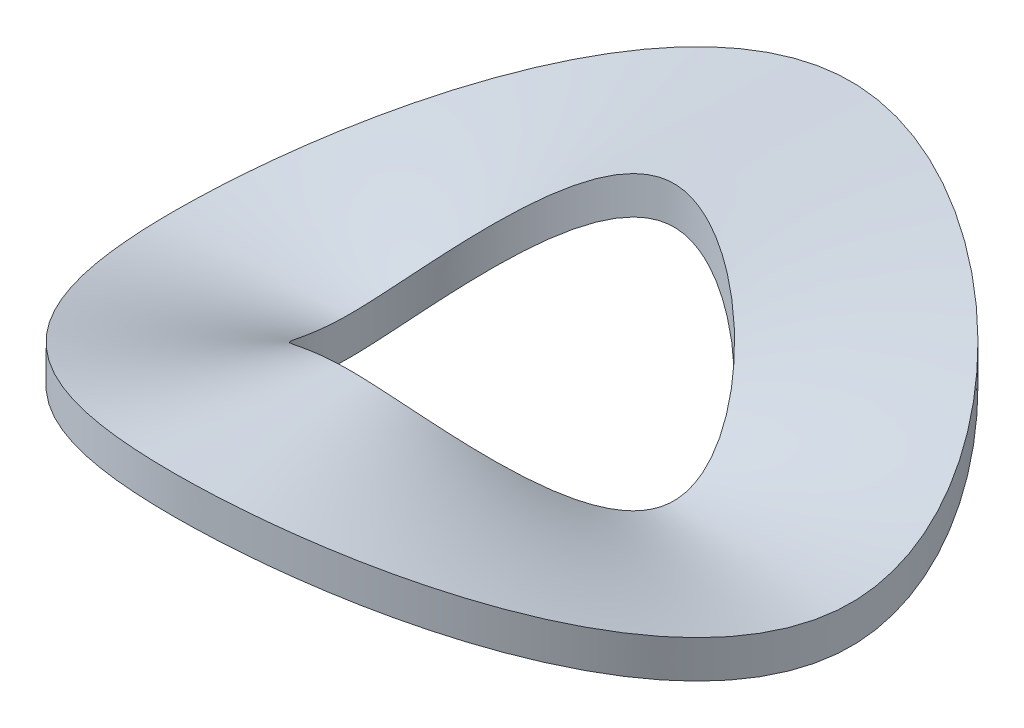
ISO-10303-21;
HEADER;
FILE_DESCRIPTION(('STEP AP214'),'2;1');
FILE_NAME('part.step','',(''),(''),'','','');
FILE_SCHEMA(('AUTOMOTIVE_DESIGN { 1 0 10303 214 1 1 1 1 }'));
ENDSEC;
DATA;
#1=APPLICATION_CONTEXT('core data for automotive mechanical design processes');
#2=APPLICATION_PROTOCOL_DEFINITION('international standard','automotive_design',2000,#1);
#3=PRODUCT_CONTEXT('',#1,'mechanical');
#4=PRODUCT('Part','Part','',(#3));
#5=PRODUCT_RELATED_PRODUCT_CATEGORY('part','',(#4));
#6=PRODUCT_DEFINITION_FORMATION('','',#4);
#7=PRODUCT_DEFINITION_CONTEXT('part definition',#1,'design');
#8=PRODUCT_DEFINITION('design','',#6,#7);
#9=PRODUCT_DEFINITION_SHAPE('','',#8);
#10=(LENGTH_UNIT() NAMED_UNIT(*) SI_UNIT(.MILLI.,.METRE.));
#11=(NAMED_UNIT(*) PLANE_ANGLE_UNIT() SI_UNIT($,.RADIAN.));
#12=(NAMED_UNIT(*) SI_UNIT($,.STERADIAN.) SOLID_ANGLE_UNIT());
#13=UNCERTAINTY_MEASURE_WITH_UNIT(LENGTH_MEASURE(1.E-05),#10,'distance_accuracy_value','');
#14=(GEOMETRIC_REPRESENTATION_CONTEXT(3) GLOBAL_UNCERTAINTY_ASSIGNED_CONTEXT((#13)) GLOBAL_UNIT_ASSIGNED_CONTEXT((#10,
#11,#12)) REPRESENTATION_CONTEXT('',''));
#15=CARTESIAN_POINT('',(0.,0.,0.));
#16=DIRECTION('',(0.,0.,1.));
#17=DIRECTION('',(1.,0.,0.));
#18=AXIS2_PLACEMENT_3D('',#15,#16,#17);
#19=CARTESIAN_POINT('',(-2.15,0.5,0.));
#20=CARTESIAN_POINT('',(-2.14999999999918,0.50000000000048,-0.0537500000001796));
#21=CARTESIAN_POINT('',(-2.14462499999738,0.507500000001514,-0.161250000000559));
#22=CARTESIAN_POINT('',(-2.12124374999426,0.539000000003236,-0.321693750001171));
#23=CARTESIAN_POINT('',(-2.08334999999078,0.588500000005074,-0.480525000001808));
#24=CARTESIAN_POINT('',(-1.77374999997496,0.980000000007716,-1.41899999998473));
#25=CARTESIAN_POINT('',(0.215000000067077,3.20000000000027,-3.01000000000131));
#26=CARTESIAN_POINT('',(3.2249999999892,-1.00000000001507,-3.33506144792675E-11));
#27=CARTESIAN_POINT('',(0.215000000010679,3.19999999999973,3.01000000000013));
#28=CARTESIAN_POINT('',(-1.77375000001122,0.979999999992285,1.41900000000339));
#29=CARTESIAN_POINT('',(-2.0833500000054,0.588499999996614,0.480525000001368));
#30=CARTESIAN_POINT('',(-2.12124375000405,0.538999999997525,0.321693750000973));
#31=CARTESIAN_POINT('',(-2.14462500000229,0.507499999998637,0.16125000000052));
#32=CARTESIAN_POINT('',(-2.15000000000082,0.49999999999952,0.05375000000018));
#33=CARTESIAN_POINT('',(-2.15,0.5,0.));
#34=CARTESIAN_POINT('',(-2.15,0.458333333333333,0.));
#35=CARTESIAN_POINT('',(-2.14999999999918,0.458333333333813,-0.0537500000001796));
#36=CARTESIAN_POINT('',(-2.14462499999738,0.465833333334847,-0.161250000000559));
#37=CARTESIAN_POINT('',(-2.12124374999426,0.49733333333657,-0.321693750001171));
#38=CARTESIAN_POINT('',(-2.08334999999078,0.546833333338407,-0.480525000001808));
#39=CARTESIAN_POINT('',(-1.77374999997496,0.938333333341049,-1.41899999998473));
#40=CARTESIAN_POINT('',(0.215000000067077,3.1583333333336,-3.01000000000131));
#41=CARTESIAN_POINT('',(3.2249999999892,-1.04166666668174,-3.33506144792675E-11));
#42=CARTESIAN_POINT('',(0.215000000010679,3.15833333333306,3.01000000000013));
#43=CARTESIAN_POINT('',(-1.77375000001122,0.938333333325618,1.41900000000339));
#44=CARTESIAN_POINT('',(-2.0833500000054,0.546833333329948,0.480525000001368));
#45=CARTESIAN_POINT('',(-2.12124375000405,0.497333333330858,0.321693750000973));
#46=CARTESIAN_POINT('',(-2.14462500000229,0.46583333333197,0.16125000000052));
#47=CARTESIAN_POINT('',(-2.15000000000082,0.458333333332854,0.05375000000018));
#48=CARTESIAN_POINT('',(-2.15,0.458333333333333,0.));
#49=CARTESIAN_POINT('',(-2.15,0.375,0.));
#50=CARTESIAN_POINT('',(-2.14999999999918,0.375000000000479,-0.0537500000001796));
#51=CARTESIAN_POINT('',(-2.14462499999738,0.382500000001514,-0.161250000000559));
#52=CARTESIAN_POINT('',(-2.12124374999426,0.414000000003236,-0.321693750001171));
#53=CARTESIAN_POINT('',(-2.08334999999078,0.463500000005074,-0.480525000001808));
#54=CARTESIAN_POINT('',(-1.77374999997496,0.855000000007716,-1.41899999998473));
#55=CARTESIAN_POINT('',(0.215000000067077,3.07500000000027,-3.01000000000131));
#56=CARTESIAN_POINT('',(3.2249999999892,-1.12500000001507,-3.3350655136849E-11));
#57=CARTESIAN_POINT('',(0.21500000001068,3.07499999999973,3.01000000000013));
#58=CARTESIAN_POINT('',(-1.77375000001122,0.854999999992285,1.4190000000034));
#59=CARTESIAN_POINT('',(-2.0833500000054,0.463499999996614,0.480525000001368));
#60=CARTESIAN_POINT('',(-2.12124375000405,0.413999999997525,0.321693750000973));
#61=CARTESIAN_POINT('',(-2.14462500000229,0.382499999998637,0.16125000000052));
#62=CARTESIAN_POINT('',(-2.15000000000082,0.37499999999952,0.05375000000018));
#63=CARTESIAN_POINT('',(-2.15,0.375,0.));
#64=CARTESIAN_POINT('',(-2.15,0.25,0.));
#65=CARTESIAN_POINT('',(-2.14999999999918,0.250000000000479,-0.0537500000001796));
#66=CARTESIAN_POINT('',(-2.14462499999738,0.257500000001514,-0.161250000000559));
#67=CARTESIAN_POINT('',(-2.12124374999426,0.289000000003236,-0.321693750001171));
#68=CARTESIAN_POINT('',(-2.08334999999078,0.338500000005073,-0.480525000001807));
#69=CARTESIAN_POINT('',(-1.77374999997496,0.730000000007715,-1.41899999998472));
#70=CARTESIAN_POINT('',(0.215000000067077,2.95000000000027,-3.01000000000131));
#71=CARTESIAN_POINT('',(3.2249999999892,-1.25000000001507,-3.33505331641046E-11));
#72=CARTESIAN_POINT('',(0.21500000001068,2.94999999999973,3.01000000000013));
#73=CARTESIAN_POINT('',(-1.77375000001122,0.729999999992284,1.41900000000339));
#74=CARTESIAN_POINT('',(-2.0833500000054,0.338499999996614,0.480525000001367));
#75=CARTESIAN_POINT('',(-2.12124375000405,0.288999999997524,0.321693750000972));
#76=CARTESIAN_POINT('',(-2.14462500000229,0.257499999998636,0.16125000000052));
#77=CARTESIAN_POINT('',(-2.15000000000082,0.24999999999952,0.0537500000001799));
#78=CARTESIAN_POINT('',(-2.15,0.25,0.));
#79=CARTESIAN_POINT('',(-2.15,0.125,0.));
#80=CARTESIAN_POINT('',(-2.14999999999918,0.12500000000048,-0.0537500000001797));
#81=CARTESIAN_POINT('',(-2.14462499999739,0.132500000001514,-0.161250000000559));
#82=CARTESIAN_POINT('',(-2.12124374999426,0.164000000003237,-0.321693750001171));
#83=CARTESIAN_POINT('',(-2.08334999999078,0.213500000005074,-0.480525000001808));
#84=CARTESIAN_POINT('',(-1.77374999997496,0.605000000007717,-1.41899999998473));
#85=CARTESIAN_POINT('',(0.215000000067077,2.82500000000027,-3.01000000000131));
#86=CARTESIAN_POINT('',(3.2249999999892,-1.37500000001507,-3.33503163236701E-11));
#87=CARTESIAN_POINT('',(0.21500000001068,2.82499999999973,3.01000000000013));
#88=CARTESIAN_POINT('',(-1.77375000001122,0.604999999992285,1.4190000000034));
#89=CARTESIAN_POINT('',(-2.0833500000054,0.213499999996615,0.480525000001368));
#90=CARTESIAN_POINT('',(-2.12124375000406,0.163999999997525,0.321693750000973));
#91=CARTESIAN_POINT('',(-2.14462500000229,0.132499999998637,0.161250000000521));
#92=CARTESIAN_POINT('',(-2.15000000000082,0.124999999999521,0.0537500000001801));
#93=CARTESIAN_POINT('',(-2.15,0.125,0.));
#94=CARTESIAN_POINT('',(-2.15,0.0416666666666665,0.));
#95=CARTESIAN_POINT('',(-2.14999999999918,0.0416666666671461,-0.0537500000001797));
#96=CARTESIAN_POINT('',(-2.14462499999738,0.0491666666681805,-0.161250000000559));
#97=CARTESIAN_POINT('',(-2.12124374999426,0.0806666666699028,-0.321693750001171));
#98=CARTESIAN_POINT('',(-2.08334999999078,0.13016666667174,-0.480525000001808));
#99=CARTESIAN_POINT('',(-1.77374999997496,0.521666666674382,-1.41899999998472));
#100=CARTESIAN_POINT('',(0.215000000067077,2.74166666666693,-3.01000000000131));
#101=CARTESIAN_POINT('',(3.2249999999892,-1.4583333333484,-3.33507364520119E-11));
#102=CARTESIAN_POINT('',(0.215000000010679,2.7416666666664,3.01000000000013));
#103=CARTESIAN_POINT('',(-1.77375000001122,0.521666666658951,1.41900000000339));
#104=CARTESIAN_POINT('',(-2.0833500000054,0.130166666663281,0.480525000001367));
#105=CARTESIAN_POINT('',(-2.12124375000405,0.0806666666641911,0.321693750000972));
#106=CARTESIAN_POINT('',(-2.14462500000229,0.0491666666653031,0.16125000000052));
#107=CARTESIAN_POINT('',(-2.15000000000082,0.041666666666187,0.0537500000001798));
#108=CARTESIAN_POINT('',(-2.15,0.0416666666666665,0.));
#109=CARTESIAN_POINT('',(-2.15,0.,0.));
#110=CARTESIAN_POINT('',(-2.14999999999918,4.79788683961516E-13,-0.0537500000001797));
#111=CARTESIAN_POINT('',(-2.14462499999738,0.0075000000015142,-0.161250000000559));
#112=CARTESIAN_POINT('',(-2.12124374999426,0.0390000000032364,-0.321693750001171));
#113=CARTESIAN_POINT('',(-2.08334999999078,0.0885000000050739,-0.480525000001808));
#114=CARTESIAN_POINT('',(-1.77374999997496,0.480000000007716,-1.41899999998473));
#115=CARTESIAN_POINT('',(0.215000000067077,2.70000000000027,-3.01000000000131));
#116=CARTESIAN_POINT('',(3.2249999999892,-1.50000000001507,-3.3350573821686E-11));
#117=CARTESIAN_POINT('',(0.215000000010679,2.69999999999973,3.01000000000013));
#118=CARTESIAN_POINT('',(-1.77375000001122,0.479999999992285,1.41900000000339));
#119=CARTESIAN_POINT('',(-2.0833500000054,0.0884999999966144,0.480525000001367));
#120=CARTESIAN_POINT('',(-2.12124375000405,0.0389999999975248,0.321693750000972));
#121=CARTESIAN_POINT('',(-2.14462500000229,0.00749999999863686,0.16125000000052));
#122=CARTESIAN_POINT('',(-2.15000000000082,-4.79336368367682E-13,0.0537500000001799));
#123=CARTESIAN_POINT('',(-2.15,0.,0.));
#124=B_SPLINE_SURFACE_WITH_KNOTS('',3,3,((#19,#20,#21,#22,#23,#24,#25,#26,#27,#28,#29,#30,#31,
#32,#33),(#34,#35,#36,#37,#38,#39,#40,#41,#42,#43,#44,#45,#46,#47,#48),(#49,#50,#51,#52,#53,#54,
#55,#56,#57,#58,#59,#60,#61,#62,#63),(#64,#65,#66,#67,#68,#69,#70,#71,#72,#73,#74,#75,#76,#77,
#78),(#79,#80,#81,#82,#83,#84,#85,#86,#87,#88,#89,#90,#91,#92,#93),(#94,#95,#96,#97,#98,#99,
#100,#101,#102,#103,#104,#105,#106,#107,#108),(#109,#110,#111,#112,#113,#114,#115,#116,#117,
#118,#119,#120,#121,#122,#123)),.UNSPECIFIED.,.F.,.T.,.F.,(4,1,1,1,4),(4,1,1,1,1,1,1,1,1,1,1,1,
4),(0.850746268656716,0.888059701492537,0.925373134328358,0.962686567164179,1.),(0.,0.0125,
0.0249999999999999,0.0375000000000001,0.05,0.249999999994977,0.500000000000455,0.75,0.95,0.9625,
0.975,0.9875,1.),.UNSPECIFIED.);
#125=CARTESIAN_POINT('',(-2.15,0.,0.));
#126=CARTESIAN_POINT('',(-2.14999999999918,4.79788683961516E-13,-0.0537500000001797));
#127=CARTESIAN_POINT('',(-2.14462499999738,0.0075000000015142,-0.161250000000559));
#128=CARTESIAN_POINT('',(-2.12124374999426,0.0390000000032364,-0.321693750001171));
#129=CARTESIAN_POINT('',(-2.08334999999078,0.0885000000050739,-0.480525000001808));
#130=CARTESIAN_POINT('',(-1.77374999997496,0.480000000007716,-1.41899999998473));
#131=CARTESIAN_POINT('',(0.215000000067077,2.70000000000027,-3.01000000000131));
#132=CARTESIAN_POINT('',(3.2249999999892,-1.50000000001507,-3.3350573821686E-11));
#133=CARTESIAN_POINT('',(0.215000000010679,2.69999999999973,3.01000000000013));
#134=CARTESIAN_POINT('',(-1.77375000001122,0.479999999992285,1.41900000000339));
#135=CARTESIAN_POINT('',(-2.0833500000054,0.0884999999966144,0.480525000001367));
#136=CARTESIAN_POINT('',(-2.12124375000405,0.0389999999975248,0.321693750000972));
#137=CARTESIAN_POINT('',(-2.14462500000229,0.00749999999863686,0.16125000000052));
#138=CARTESIAN_POINT('',(-2.15000000000082,-4.79336368367682E-13,0.0537500000001799));
#139=CARTESIAN_POINT('',(-2.15,0.,0.));
#140=B_SPLINE_CURVE_WITH_KNOTS('',3,(#125,#126,#127,#128,#129,#130,#131,#132,#133,#134,#135,
#136,#137,#138,#139),.UNSPECIFIED.,.T.,.F.,(4,1,1,1,1,1,1,1,1,1,1,1,4),(0.,0.0125,
0.0249999999999999,0.0375000000000001,0.05,0.249999999994977,0.500000000000455,0.75,0.95,0.9625,
0.975,0.9875,1.),.UNSPECIFIED.);
#141=CARTESIAN_POINT('',(-2.15,0.,0.));
#142=VERTEX_POINT('',#141);
#143=EDGE_CURVE('E11',#142,#142,#140,.T.);
#144=CARTESIAN_POINT('',(-2.15,0.5,0.));
#145=CARTESIAN_POINT('',(-2.14999999999918,0.50000000000048,-0.0537500000001796));
#146=CARTESIAN_POINT('',(-2.14462499999738,0.507500000001514,-0.161250000000559));
#147=CARTESIAN_POINT('',(-2.12124374999426,0.539000000003236,-0.321693750001171));
#148=CARTESIAN_POINT('',(-2.08334999999078,0.588500000005074,-0.480525000001808));
#149=CARTESIAN_POINT('',(-1.77374999997496,0.980000000007716,-1.41899999998473));
#150=CARTESIAN_POINT('',(0.215000000067077,3.20000000000027,-3.01000000000131));
#151=CARTESIAN_POINT('',(3.2249999999892,-1.00000000001507,-3.33506144792675E-11));
#152=CARTESIAN_POINT('',(0.215000000010679,3.19999999999973,3.01000000000013));
#153=CARTESIAN_POINT('',(-1.77375000001122,0.979999999992285,1.41900000000339));
#154=CARTESIAN_POINT('',(-2.0833500000054,0.588499999996614,0.480525000001368));
#155=CARTESIAN_POINT('',(-2.12124375000405,0.538999999997525,0.321693750000973));
#156=CARTESIAN_POINT('',(-2.14462500000229,0.507499999998637,0.16125000000052));
#157=CARTESIAN_POINT('',(-2.15000000000082,0.49999999999952,0.05375000000018));
#158=CARTESIAN_POINT('',(-2.15,0.5,0.));
#159=B_SPLINE_CURVE_WITH_KNOTS('',3,(#144,#145,#146,#147,#148,#149,#150,#151,#152,#153,#154,
#155,#156,#157,#158),.UNSPECIFIED.,.T.,.F.,(4,1,1,1,1,1,1,1,1,1,1,1,4),(0.,0.0125,
0.0249999999999999,0.0375000000000001,0.05,0.249999999994977,0.500000000000455,0.75,0.95,0.9625,
0.975,0.9875,1.),.UNSPECIFIED.);
#160=CARTESIAN_POINT('',(-2.15,0.5,0.));
#161=VERTEX_POINT('',#160);
#162=EDGE_CURVE('E57',#161,#161,#159,.T.);
#163=ORIENTED_EDGE('',*,*,#143,.T.);
#164=EDGE_LOOP('',(#163));
#165=FACE_BOUND('',#164,.T.);
#166=ORIENTED_EDGE('',*,*,#162,.F.);
#167=EDGE_LOOP('',(#166));
#168=FACE_BOUND('',#167,.T.);
#169=ADVANCED_FACE('F46',(#165,#168),#124,.T.);
#170=CARTESIAN_POINT('',(-4.5,0.5,0.));
#171=CARTESIAN_POINT('',(-4.49999999999829,0.50000000000048,-0.112500000000376));
#172=CARTESIAN_POINT('',(-4.48874999999452,0.507500000001514,-0.33750000000117));
#173=CARTESIAN_POINT('',(-4.43981249998799,0.539000000003236,-0.67331250000245));
#174=CARTESIAN_POINT('',(-4.36049999998069,0.588500000005074,-1.00575000000378));
#175=CARTESIAN_POINT('',(-3.71249999994758,0.980000000007716,-2.96999999996803));
#176=CARTESIAN_POINT('',(0.450000000140394,3.20000000000027,-6.30000000000274));
#177=CARTESIAN_POINT('',(6.7499999999774,-1.00000000001507,-6.98035921599394E-11));
#178=CARTESIAN_POINT('',(0.450000000022352,3.19999999999973,6.30000000000027));
#179=CARTESIAN_POINT('',(-3.71250000002348,0.979999999992285,2.97000000000711));
#180=CARTESIAN_POINT('',(-4.3605000000113,0.588499999996614,1.00575000000286));
#181=CARTESIAN_POINT('',(-4.43981250000848,0.538999999997525,0.673312500002035));
#182=CARTESIAN_POINT('',(-4.4887500000048,0.507499999998637,0.337500000001089));
#183=CARTESIAN_POINT('',(-4.50000000000171,0.499999999999521,0.112500000000377));
#184=CARTESIAN_POINT('',(-4.5,0.5,0.));
#185=CARTESIAN_POINT('',(-4.30416666666667,0.5,0.));
#186=CARTESIAN_POINT('',(-4.30416666666503,0.50000000000048,-0.107604166667026));
#187=CARTESIAN_POINT('',(-4.29340624999476,0.507500000001514,-0.322812500001119));
#188=CARTESIAN_POINT('',(-4.24659843748851,0.539000000003236,-0.644010937502344));
#189=CARTESIAN_POINT('',(-4.17073749998153,0.588500000005074,-0.961981250003619));
#190=CARTESIAN_POINT('',(-3.55093749994986,0.980000000007716,-2.84074999996942));
#191=CARTESIAN_POINT('',(0.430416666800951,3.20000000000027,-6.02583333333596));
#192=CARTESIAN_POINT('',(6.45624999997838,-1.00000000001507,-6.67661997737212E-11));
#193=CARTESIAN_POINT('',(0.430416666688046,3.19999999999973,6.02583333333359));
#194=CARTESIAN_POINT('',(-3.55093750002246,0.979999999992285,2.8407500000068));
#195=CARTESIAN_POINT('',(-4.17073750001081,0.588499999996614,0.961981250002738));
#196=CARTESIAN_POINT('',(-4.24659843750811,0.538999999997525,0.644010937501947));
#197=CARTESIAN_POINT('',(-4.29340625000459,0.507499999998637,0.322812500001042));
#198=CARTESIAN_POINT('',(-4.3041666666683,0.499999999999521,0.107604166667027));
#199=CARTESIAN_POINT('',(-4.30416666666667,0.5,0.));
#200=CARTESIAN_POINT('',(-3.9125,0.499999999999999,0.));
#201=CARTESIAN_POINT('',(-3.91249999999851,0.500000000000479,-0.0978125000003266));
#202=CARTESIAN_POINT('',(-3.90271874999524,0.507500000001513,-0.293437500001017));
#203=CARTESIAN_POINT('',(-3.86017031248956,0.539000000003235,-0.58540781250213));
#204=CARTESIAN_POINT('',(-3.79121249998322,0.588500000005072,-0.87444375000329));
#205=CARTESIAN_POINT('',(-3.22781249995443,0.980000000007714,-2.58224999997221));
#206=CARTESIAN_POINT('',(0.391250000122065,3.20000000000026,-5.47750000000239));
#207=CARTESIAN_POINT('',(5.86874999998035,-1.00000000001507,-6.06902494839495E-11));
#208=CARTESIAN_POINT('',(0.391250000019435,3.19999999999973,5.47750000000023));
#209=CARTESIAN_POINT('',(-3.22781250002042,0.979999999992283,2.58225000000618));
#210=CARTESIAN_POINT('',(-3.79121250000983,0.588499999996613,0.874443750002489));
#211=CARTESIAN_POINT('',(-3.86017031250738,0.538999999997523,0.58540781250177));
#212=CARTESIAN_POINT('',(-3.90271875000417,0.507499999998636,0.293437500000947));
#213=CARTESIAN_POINT('',(-3.91250000000149,0.499999999999519,0.0978125000003278));
#214=CARTESIAN_POINT('',(-3.9125,0.499999999999999,0.));
#215=CARTESIAN_POINT('',(-3.325,0.500000000000001,0.));
#216=CARTESIAN_POINT('',(-3.32499999999873,0.500000000000481,-0.0831250000002774));
#217=CARTESIAN_POINT('',(-3.31668749999595,0.507500000001515,-0.249375000000864));
#218=CARTESIAN_POINT('',(-3.28052812499112,0.539000000003238,-0.49750312500181));
#219=CARTESIAN_POINT('',(-3.22192499998573,0.588500000005075,-0.743137500002795));
#220=CARTESIAN_POINT('',(-2.74312499996127,0.980000000007718,-2.19449999997638));
#221=CARTESIAN_POINT('',(0.332500000103735,3.20000000000027,-4.65500000000202));
#222=CARTESIAN_POINT('',(4.98749999998329,-1.00000000001507,-5.15769610180683E-11));
#223=CARTESIAN_POINT('',(0.332500000016516,3.19999999999974,4.6550000000002));
#224=CARTESIAN_POINT('',(-2.74312500001735,0.979999999992287,2.19450000000525));
#225=CARTESIAN_POINT('',(-3.22192500000835,0.588499999996616,0.743137500002115));
#226=CARTESIAN_POINT('',(-3.28052812500627,0.538999999997526,0.497503125001504));
#227=CARTESIAN_POINT('',(-3.31668750000354,0.507499999998638,0.249375000000805));
#228=CARTESIAN_POINT('',(-3.32500000000126,0.499999999999521,0.0831250000002786));
#229=CARTESIAN_POINT('',(-3.325,0.500000000000001,0.));
#230=CARTESIAN_POINT('',(-2.7375,0.499999999999999,0.));
#231=CARTESIAN_POINT('',(-2.73749999999896,0.500000000000479,-0.0684375000002286));
#232=CARTESIAN_POINT('',(-2.73065624999667,0.507500000001513,-0.205312500000712));
#233=CARTESIAN_POINT('',(-2.70088593749269,0.539000000003235,-0.409598437501491));
#234=CARTESIAN_POINT('',(-2.65263749998826,0.588500000005073,-0.611831250002302));
#235=CARTESIAN_POINT('',(-2.25843749996811,0.980000000007714,-1.80674999998055));
#236=CARTESIAN_POINT('',(0.273750000085406,3.20000000000026,-3.83250000000167));
#237=CARTESIAN_POINT('',(4.10624999998625,-1.00000000001507,-4.24637267622957E-11));
#238=CARTESIAN_POINT('',(0.273750000013598,3.19999999999973,3.83250000000016));
#239=CARTESIAN_POINT('',(-2.25843750001429,0.979999999992283,1.80675000000432));
#240=CARTESIAN_POINT('',(-2.65263750000688,0.588499999996613,0.611831250001742));
#241=CARTESIAN_POINT('',(-2.70088593750516,0.538999999997524,0.409598437501238));
#242=CARTESIAN_POINT('',(-2.73065625000292,0.507499999998636,0.205312500000663));
#243=CARTESIAN_POINT('',(-2.73750000000104,0.499999999999519,0.0684375000002293));
#244=CARTESIAN_POINT('',(-2.7375,0.499999999999999,0.));
#245=CARTESIAN_POINT('',(-2.34583333333333,0.5,0.));
#246=CARTESIAN_POINT('',(-2.34583333333244,0.50000000000048,-0.0586458333335294));
#247=CARTESIAN_POINT('',(-2.33996874999715,0.507500000001514,-0.17593750000061));
#248=CARTESIAN_POINT('',(-2.31445781249374,0.539000000003236,-0.350995312501278));
#249=CARTESIAN_POINT('',(-2.27311249998993,0.588500000005074,-0.524293750001973));
#250=CARTESIAN_POINT('',(-1.93531249997267,0.980000000007716,-1.54824999998333));
#251=CARTESIAN_POINT('',(0.23458333340652,3.20000000000027,-3.2841666666681));
#252=CARTESIAN_POINT('',(3.51874999998822,-1.00000000001507,-3.6388467651409E-11));
#253=CARTESIAN_POINT('',(0.234583333344986,3.19999999999973,3.28416666666681));
#254=CARTESIAN_POINT('',(-1.93531250001224,0.979999999992285,1.5482500000037));
#255=CARTESIAN_POINT('',(-2.27311250000589,0.588499999996614,0.524293750001492));
#256=CARTESIAN_POINT('',(-2.31445781250442,0.538999999997525,0.350995312501061));
#257=CARTESIAN_POINT('',(-2.3399687500025,0.507499999998637,0.175937500000568));
#258=CARTESIAN_POINT('',(-2.34583333333423,0.49999999999952,0.0586458333335297));
#259=CARTESIAN_POINT('',(-2.34583333333333,0.5,0.));
#260=CARTESIAN_POINT('',(-2.15,0.5,0.));
#261=CARTESIAN_POINT('',(-2.14999999999918,0.50000000000048,-0.0537500000001796));
#262=CARTESIAN_POINT('',(-2.14462499999738,0.507500000001514,-0.161250000000559));
#263=CARTESIAN_POINT('',(-2.12124374999426,0.539000000003236,-0.321693750001171));
#264=CARTESIAN_POINT('',(-2.08334999999078,0.588500000005074,-0.480525000001808));
#265=CARTESIAN_POINT('',(-1.77374999997496,0.980000000007716,-1.41899999998473));
#266=CARTESIAN_POINT('',(0.215000000067077,3.20000000000027,-3.01000000000131));
#267=CARTESIAN_POINT('',(3.2249999999892,-1.00000000001507,-3.33506144792675E-11));
#268=CARTESIAN_POINT('',(0.215000000010679,3.19999999999973,3.01000000000013));
#269=CARTESIAN_POINT('',(-1.77375000001122,0.979999999992285,1.41900000000339));
#270=CARTESIAN_POINT('',(-2.0833500000054,0.588499999996614,0.480525000001368));
#271=CARTESIAN_POINT('',(-2.12124375000405,0.538999999997525,0.321693750000973));
#272=CARTESIAN_POINT('',(-2.14462500000229,0.507499999998637,0.16125000000052));
#273=CARTESIAN_POINT('',(-2.15000000000082,0.49999999999952,0.05375000000018));
#274=CARTESIAN_POINT('',(-2.15,0.5,0.));
#275=B_SPLINE_SURFACE_WITH_KNOTS('',3,3,((#170,#171,#172,#173,#174,#175,#176,#177,#178,#179,
#180,#181,#182,#183,#184),(#185,#186,#187,#188,#189,#190,#191,#192,#193,#194,#195,#196,#197,
#198,#199),(#200,#201,#202,#203,#204,#205,#206,#207,#208,#209,#210,#211,#212,#213,#214),(#215,
#216,#217,#218,#219,#220,#221,#222,#223,#224,#225,#226,#227,#228,#229),(#230,#231,#232,#233,
#234,#235,#236,#237,#238,#239,#240,#241,#242,#243,#244),(#245,#246,#247,#248,#249,#250,#251,
#252,#253,#254,#255,#256,#257,#258,#259),(#260,#261,#262,#263,#264,#265,#266,#267,#268,#269,
#270,#271,#272,#273,#274)),.UNSPECIFIED.,.F.,.T.,.F.,(4,1,1,1,4),(4,1,1,1,1,1,1,1,1,1,1,1,4),
(0.149253731343284,0.324626865671642,0.5,0.675373134328358,0.850746268656716),(0.,0.0125,
0.0249999999999999,0.0375000000000001,0.05,0.249999999994977,0.500000000000455,0.75,0.95,0.9625,
0.975,0.9875,1.),.UNSPECIFIED.);
#276=CARTESIAN_POINT('',(-4.5,0.5,0.));
#277=CARTESIAN_POINT('',(-4.49999999999829,0.50000000000048,-0.112500000000376));
#278=CARTESIAN_POINT('',(-4.48874999999452,0.507500000001514,-0.33750000000117));
#279=CARTESIAN_POINT('',(-4.43981249998799,0.539000000003236,-0.67331250000245));
#280=CARTESIAN_POINT('',(-4.36049999998069,0.588500000005074,-1.00575000000378));
#281=CARTESIAN_POINT('',(-3.71249999994758,0.980000000007716,-2.96999999996803));
#282=CARTESIAN_POINT('',(0.450000000140394,3.20000000000027,-6.30000000000274));
#283=CARTESIAN_POINT('',(6.7499999999774,-1.00000000001507,-6.98035921599394E-11));
#284=CARTESIAN_POINT('',(0.450000000022352,3.19999999999973,6.30000000000027));
#285=CARTESIAN_POINT('',(-3.71250000002348,0.979999999992285,2.97000000000711));
#286=CARTESIAN_POINT('',(-4.3605000000113,0.588499999996614,1.00575000000286));
#287=CARTESIAN_POINT('',(-4.43981250000848,0.538999999997525,0.673312500002035));
#288=CARTESIAN_POINT('',(-4.4887500000048,0.507499999998637,0.337500000001089));
#289=CARTESIAN_POINT('',(-4.50000000000171,0.499999999999521,0.112500000000377));
#290=CARTESIAN_POINT('',(-4.5,0.5,0.));
#291=B_SPLINE_CURVE_WITH_KNOTS('',3,(#276,#277,#278,#279,#280,#281,#282,#283,#284,#285,#286,
#287,#288,#289,#290),.UNSPECIFIED.,.T.,.F.,(4,1,1,1,1,1,1,1,1,1,1,1,4),(0.,0.0125,
0.0249999999999999,0.0375000000000001,0.05,0.249999999994977,0.500000000000455,0.75,0.95,0.9625,
0.975,0.9875,1.),.UNSPECIFIED.);
#292=CARTESIAN_POINT('',(-4.5,0.5,0.));
#293=VERTEX_POINT('',#292);
#294=EDGE_CURVE('E61',#293,#293,#291,.T.);
#295=ORIENTED_EDGE('',*,*,#162,.T.);
#296=EDGE_LOOP('',(#295));
#297=FACE_BOUND('',#296,.T.);
#298=ORIENTED_EDGE('',*,*,#294,.F.);
#299=EDGE_LOOP('',(#298));
#300=FACE_BOUND('',#299,.T.);
#301=ADVANCED_FACE('F89',(#297,#300),#275,.T.);
#302=CARTESIAN_POINT('',(-4.5,0.,0.));
#303=CARTESIAN_POINT('',(-4.49999999999829,4.79791225060358E-13,-0.112500000000376));
#304=CARTESIAN_POINT('',(-4.48874999999452,0.00750000000151422,-0.33750000000117));
#305=CARTESIAN_POINT('',(-4.43981249998799,0.0390000000032365,-0.67331250000245));
#306=CARTESIAN_POINT('',(-4.36049999998069,0.0885000000050739,-1.00575000000378));
#307=CARTESIAN_POINT('',(-3.71249999994758,0.480000000007716,-2.96999999996803));
#308=CARTESIAN_POINT('',(0.450000000140394,2.70000000000027,-6.30000000000274));
#309=CARTESIAN_POINT('',(6.7499999999774,-1.50000000001507,-6.98035921599394E-11));
#310=CARTESIAN_POINT('',(0.450000000022353,2.69999999999973,6.30000000000027));
#311=CARTESIAN_POINT('',(-3.71250000002348,0.479999999992285,2.97000000000711));
#312=CARTESIAN_POINT('',(-4.3605000000113,0.0884999999966143,1.00575000000286));
#313=CARTESIAN_POINT('',(-4.43981250000848,0.0389999999975248,0.673312500002035));
#314=CARTESIAN_POINT('',(-4.4887500000048,0.00749999999863684,0.337500000001089));
#315=CARTESIAN_POINT('',(-4.50000000000171,-4.79343568147734E-13,0.112500000000377));
#316=CARTESIAN_POINT('',(-4.5,0.,0.));
#317=CARTESIAN_POINT('',(-4.5,0.0416666666666668,0.));
#318=CARTESIAN_POINT('',(-4.49999999999829,0.0416666666671464,-0.112500000000376));
#319=CARTESIAN_POINT('',(-4.48874999999452,0.0491666666681808,-0.33750000000117));
#320=CARTESIAN_POINT('',(-4.43981249998799,0.0806666666699031,-0.67331250000245));
#321=CARTESIAN_POINT('',(-4.36049999998069,0.130166666671741,-1.00575000000378));
#322=CARTESIAN_POINT('',(-3.71249999994758,0.521666666674383,-2.96999999996803));
#323=CARTESIAN_POINT('',(0.450000000140394,2.74166666666693,-6.30000000000274));
#324=CARTESIAN_POINT('',(6.7499999999774,-1.4583333333484,-6.98035921599394E-11));
#325=CARTESIAN_POINT('',(0.450000000022353,2.7416666666664,6.30000000000027));
#326=CARTESIAN_POINT('',(-3.71250000002348,0.521666666658952,2.97000000000711));
#327=CARTESIAN_POINT('',(-4.3605000000113,0.130166666663281,1.00575000000286));
#328=CARTESIAN_POINT('',(-4.43981250000848,0.0806666666641914,0.673312500002035));
#329=CARTESIAN_POINT('',(-4.4887500000048,0.0491666666653034,0.337500000001089));
#330=CARTESIAN_POINT('',(-4.50000000000171,0.0416666666661872,0.112500000000377));
#331=CARTESIAN_POINT('',(-4.5,0.0416666666666668,0.));
#332=CARTESIAN_POINT('',(-4.5,0.125,0.));
#333=CARTESIAN_POINT('',(-4.49999999999829,0.12500000000048,-0.112500000000376));
#334=CARTESIAN_POINT('',(-4.48874999999452,0.132500000001514,-0.337500000001169));
#335=CARTESIAN_POINT('',(-4.43981249998799,0.164000000003236,-0.67331250000245));
#336=CARTESIAN_POINT('',(-4.36049999998069,0.213500000005074,-1.00575000000378));
#337=CARTESIAN_POINT('',(-3.71249999994758,0.605000000007716,-2.96999999996803));
#338=CARTESIAN_POINT('',(0.450000000140394,2.82500000000027,-6.30000000000274));
#339=CARTESIAN_POINT('',(6.7499999999774,-1.37500000001507,-6.98035108447764E-11));
#340=CARTESIAN_POINT('',(0.450000000022353,2.82499999999973,6.30000000000027));
#341=CARTESIAN_POINT('',(-3.71250000002349,0.604999999992285,2.9700000000071));
#342=CARTESIAN_POINT('',(-4.36050000001131,0.213499999996614,1.00575000000286));
#343=CARTESIAN_POINT('',(-4.43981250000849,0.163999999997525,0.673312500002035));
#344=CARTESIAN_POINT('',(-4.4887500000048,0.132499999998637,0.337500000001089));
#345=CARTESIAN_POINT('',(-4.50000000000171,0.12499999999952,0.112500000000377));
#346=CARTESIAN_POINT('',(-4.5,0.125,0.));
#347=CARTESIAN_POINT('',(-4.5,0.25,0.));
#348=CARTESIAN_POINT('',(-4.49999999999829,0.25000000000048,-0.112500000000376));
#349=CARTESIAN_POINT('',(-4.48874999999453,0.257500000001514,-0.33750000000117));
#350=CARTESIAN_POINT('',(-4.43981249998799,0.289000000003236,-0.673312500002451));
#351=CARTESIAN_POINT('',(-4.3604999999807,0.338500000005074,-1.00575000000378));
#352=CARTESIAN_POINT('',(-3.71249999994758,0.730000000007716,-2.96999999996803));
#353=CARTESIAN_POINT('',(0.450000000140394,2.95000000000027,-6.30000000000275));
#354=CARTESIAN_POINT('',(6.7499999999774,-1.25000000001507,-6.98033753195049E-11));
#355=CARTESIAN_POINT('',(0.450000000022353,2.94999999999973,6.30000000000027));
#356=CARTESIAN_POINT('',(-3.71250000002349,0.729999999992285,2.97000000000711));
#357=CARTESIAN_POINT('',(-4.36050000001131,0.338499999996614,1.00575000000286));
#358=CARTESIAN_POINT('',(-4.43981250000849,0.288999999997525,0.673312500002036));
#359=CARTESIAN_POINT('',(-4.4887500000048,0.257499999998637,0.337500000001089));
#360=CARTESIAN_POINT('',(-4.50000000000172,0.249999999999521,0.112500000000377));
#361=CARTESIAN_POINT('',(-4.5,0.25,0.));
#362=CARTESIAN_POINT('',(-4.5,0.375,0.));
#363=CARTESIAN_POINT('',(-4.49999999999828,0.37500000000048,-0.112500000000376));
#364=CARTESIAN_POINT('',(-4.48874999999452,0.382500000001514,-0.337500000001169));
#365=CARTESIAN_POINT('',(-4.43981249998799,0.414000000003236,-0.67331250000245));
#366=CARTESIAN_POINT('',(-4.36049999998069,0.463500000005074,-1.00575000000378));
#367=CARTESIAN_POINT('',(-3.71249999994758,0.855000000007715,-2.96999999996803));
#368=CARTESIAN_POINT('',(0.450000000140394,3.07500000000027,-6.30000000000274));
#369=CARTESIAN_POINT('',(6.74999999997739,-1.12500000001507,-6.98033482144506E-11));
#370=CARTESIAN_POINT('',(0.450000000022352,3.07499999999973,6.30000000000026));
#371=CARTESIAN_POINT('',(-3.71250000002348,0.854999999992285,2.9700000000071));
#372=CARTESIAN_POINT('',(-4.3605000000113,0.463499999996614,1.00575000000286));
#373=CARTESIAN_POINT('',(-4.43981250000848,0.413999999997525,0.673312500002035));
#374=CARTESIAN_POINT('',(-4.48875000000479,0.382499999998637,0.337500000001089));
#375=CARTESIAN_POINT('',(-4.50000000000171,0.37499999999952,0.112500000000377));
#376=CARTESIAN_POINT('',(-4.5,0.375,0.));
#377=CARTESIAN_POINT('',(-4.5,0.458333333333333,0.));
#378=CARTESIAN_POINT('',(-4.49999999999829,0.458333333333813,-0.112500000000376));
#379=CARTESIAN_POINT('',(-4.48874999999452,0.465833333334847,-0.33750000000117));
#380=CARTESIAN_POINT('',(-4.43981249998799,0.49733333333657,-0.67331250000245));
#381=CARTESIAN_POINT('',(-4.36049999998069,0.546833333338407,-1.00575000000378));
#382=CARTESIAN_POINT('',(-3.71249999994758,0.938333333341049,-2.96999999996803));
#383=CARTESIAN_POINT('',(0.450000000140394,3.1583333333336,-6.30000000000274));
#384=CARTESIAN_POINT('',(6.7499999999774,-1.04166666668174,-6.98035921599394E-11));
#385=CARTESIAN_POINT('',(0.450000000022352,3.15833333333307,6.30000000000027));
#386=CARTESIAN_POINT('',(-3.71250000002348,0.938333333325619,2.97000000000711));
#387=CARTESIAN_POINT('',(-4.3605000000113,0.546833333329948,1.00575000000286));
#388=CARTESIAN_POINT('',(-4.43981250000848,0.497333333330858,0.673312500002035));
#389=CARTESIAN_POINT('',(-4.4887500000048,0.46583333333197,0.337500000001089));
#390=CARTESIAN_POINT('',(-4.50000000000171,0.458333333332854,0.112500000000377));
#391=CARTESIAN_POINT('',(-4.5,0.458333333333333,0.));
#392=CARTESIAN_POINT('',(-4.5,0.5,0.));
#393=CARTESIAN_POINT('',(-4.49999999999829,0.50000000000048,-0.112500000000376));
#394=CARTESIAN_POINT('',(-4.48874999999452,0.507500000001514,-0.33750000000117));
#395=CARTESIAN_POINT('',(-4.43981249998799,0.539000000003236,-0.67331250000245));
#396=CARTESIAN_POINT('',(-4.36049999998069,0.588500000005074,-1.00575000000378));
#397=CARTESIAN_POINT('',(-3.71249999994758,0.980000000007716,-2.96999999996803));
#398=CARTESIAN_POINT('',(0.450000000140394,3.20000000000027,-6.30000000000274));
#399=CARTESIAN_POINT('',(6.7499999999774,-1.00000000001507,-6.98035921599394E-11));
#400=CARTESIAN_POINT('',(0.450000000022352,3.19999999999973,6.30000000000027));
#401=CARTESIAN_POINT('',(-3.71250000002348,0.979999999992285,2.97000000000711));
#402=CARTESIAN_POINT('',(-4.3605000000113,0.588499999996614,1.00575000000286));
#403=CARTESIAN_POINT('',(-4.43981250000848,0.538999999997525,0.673312500002035));
#404=CARTESIAN_POINT('',(-4.4887500000048,0.507499999998637,0.337500000001089));
#405=CARTESIAN_POINT('',(-4.50000000000171,0.499999999999521,0.112500000000377));
#406=CARTESIAN_POINT('',(-4.5,0.5,0.));
#407=B_SPLINE_SURFACE_WITH_KNOTS('',3,3,((#302,#303,#304,#305,#306,#307,#308,#309,#310,#311,
#312,#313,#314,#315,#316),(#317,#318,#319,#320,#321,#322,#323,#324,#325,#326,#327,#328,#329,
#330,#331),(#332,#333,#334,#335,#336,#337,#338,#339,#340,#341,#342,#343,#344,#345,#346),(#347,
#348,#349,#350,#351,#352,#353,#354,#355,#356,#357,#358,#359,#360,#361),(#362,#363,#364,#365,
#366,#367,#368,#369,#370,#371,#372,#373,#374,#375,#376),(#377,#378,#379,#380,#381,#382,#383,
#384,#385,#386,#387,#388,#389,#390,#391),(#392,#393,#394,#395,#396,#397,#398,#399,#400,#401,
#402,#403,#404,#405,#406)),.UNSPECIFIED.,.F.,.T.,.F.,(4,1,1,1,4),(4,1,1,1,1,1,1,1,1,1,1,1,4),
(0.,0.0373134328358209,0.0746268656716418,0.111940298507463,0.149253731343284),(0.,0.0125,
0.0249999999999999,0.0375000000000001,0.05,0.249999999994977,0.500000000000455,0.75,0.95,0.9625,
0.975,0.9875,1.),.UNSPECIFIED.);
#408=CARTESIAN_POINT('',(-4.5,0.,0.));
#409=CARTESIAN_POINT('',(-4.49999999999829,4.79791225060358E-13,-0.112500000000376));
#410=CARTESIAN_POINT('',(-4.48874999999452,0.00750000000151422,-0.33750000000117));
#411=CARTESIAN_POINT('',(-4.43981249998799,0.0390000000032365,-0.67331250000245));
#412=CARTESIAN_POINT('',(-4.36049999998069,0.0885000000050739,-1.00575000000378));
#413=CARTESIAN_POINT('',(-3.71249999994758,0.480000000007716,-2.96999999996803));
#414=CARTESIAN_POINT('',(0.450000000140394,2.70000000000027,-6.30000000000274));
#415=CARTESIAN_POINT('',(6.7499999999774,-1.50000000001507,-6.98035921599394E-11));
#416=CARTESIAN_POINT('',(0.450000000022353,2.69999999999973,6.30000000000027));
#417=CARTESIAN_POINT('',(-3.71250000002348,0.479999999992285,2.97000000000711));
#418=CARTESIAN_POINT('',(-4.3605000000113,0.0884999999966143,1.00575000000286));
#419=CARTESIAN_POINT('',(-4.43981250000848,0.0389999999975248,0.673312500002035));
#420=CARTESIAN_POINT('',(-4.4887500000048,0.00749999999863684,0.337500000001089));
#421=CARTESIAN_POINT('',(-4.50000000000171,-4.79343568147734E-13,0.112500000000377));
#422=CARTESIAN_POINT('',(-4.5,0.,0.));
#423=B_SPLINE_CURVE_WITH_KNOTS('',3,(#408,#409,#410,#411,#412,#413,#414,#415,#416,#417,#418,
#419,#420,#421,#422),.UNSPECIFIED.,.T.,.F.,(4,1,1,1,1,1,1,1,1,1,1,1,4),(0.,0.0125,
0.0249999999999999,0.0375000000000001,0.05,0.249999999994977,0.500000000000455,0.75,0.95,0.9625,
0.975,0.9875,1.),.UNSPECIFIED.);
#424=CARTESIAN_POINT('',(-4.5,0.,0.));
#425=VERTEX_POINT('',#424);
#426=EDGE_CURVE('E65',#425,#425,#423,.T.);
#427=ORIENTED_EDGE('',*,*,#294,.T.);
#428=EDGE_LOOP('',(#427));
#429=FACE_BOUND('',#428,.T.);
#430=ORIENTED_EDGE('',*,*,#426,.F.);
#431=EDGE_LOOP('',(#430));
#432=FACE_BOUND('',#431,.T.);
#433=ADVANCED_FACE('F87',(#429,#432),#407,.T.);
#434=CARTESIAN_POINT('',(-2.15,0.,0.));
#435=CARTESIAN_POINT('',(-2.14999999999918,4.79791225060358E-13,-0.0537500000001796));
#436=CARTESIAN_POINT('',(-2.14462499999738,0.00750000000151422,-0.161250000000559));
#437=CARTESIAN_POINT('',(-2.12124374999426,0.0390000000032365,-0.321693750001171));
#438=CARTESIAN_POINT('',(-2.08334999999078,0.0885000000050739,-0.480525000001808));
#439=CARTESIAN_POINT('',(-1.77374999997496,0.480000000007716,-1.41899999998473));
#440=CARTESIAN_POINT('',(0.215000000067077,2.70000000000027,-3.01000000000131));
#441=CARTESIAN_POINT('',(3.2249999999892,-1.50000000001507,-3.33506144792675E-11));
#442=CARTESIAN_POINT('',(0.21500000001068,2.69999999999973,3.01000000000013));
#443=CARTESIAN_POINT('',(-1.77375000001122,0.479999999992285,1.41900000000339));
#444=CARTESIAN_POINT('',(-2.0833500000054,0.0884999999966143,0.480525000001368));
#445=CARTESIAN_POINT('',(-2.12124375000405,0.0389999999975248,0.321693750000973));
#446=CARTESIAN_POINT('',(-2.14462500000229,0.00749999999863684,0.16125000000052));
#447=CARTESIAN_POINT('',(-2.15000000000082,-4.79343568147734E-13,0.05375000000018));
#448=CARTESIAN_POINT('',(-2.15,0.,0.));
#449=CARTESIAN_POINT('',(-2.93333333333333,0.,0.));
#450=CARTESIAN_POINT('',(-2.93333333333222,4.79791225060358E-13,-0.0733333333335783));
#451=CARTESIAN_POINT('',(-2.92599999999643,0.00750000000151422,-0.220000000000762));
#452=CARTESIAN_POINT('',(-2.89409999999217,0.0390000000032365,-0.438900000001597));
#453=CARTESIAN_POINT('',(-2.84239999998742,0.0885000000050739,-0.655600000002466));
#454=CARTESIAN_POINT('',(-2.41999999996583,0.480000000007716,-1.93599999997916));
#455=CARTESIAN_POINT('',(0.29333333342485,2.70000000000027,-4.10666666666845));
#456=CARTESIAN_POINT('',(4.39999999998527,-1.50000000001507,-4.55014173041113E-11));
#457=CARTESIAN_POINT('',(0.293333333347904,2.69999999999973,4.10666666666684));
#458=CARTESIAN_POINT('',(-2.42000000001531,0.479999999992285,1.93600000000463));
#459=CARTESIAN_POINT('',(-2.84240000000737,0.0884999999966143,0.655600000001866));
#460=CARTESIAN_POINT('',(-2.89410000000553,0.0389999999975248,0.438900000001327));
#461=CARTESIAN_POINT('',(-2.92600000000313,0.00749999999863684,0.22000000000071));
#462=CARTESIAN_POINT('',(-2.93333333333445,-4.79343568147734E-13,0.073333333333579));
#463=CARTESIAN_POINT('',(-2.93333333333333,0.,0.));
#464=CARTESIAN_POINT('',(-3.71666666666667,0.,0.));
#465=CARTESIAN_POINT('',(-3.71666666666525,4.79791225060358E-13,-0.0929166666669771));
#466=CARTESIAN_POINT('',(-3.70737499999548,0.00750000000151422,-0.278750000000966));
#467=CARTESIAN_POINT('',(-3.66695624999008,0.0390000000032365,-0.556106250002024));
#468=CARTESIAN_POINT('',(-3.60144999998405,0.0885000000050739,-0.830675000003125));
#469=CARTESIAN_POINT('',(-3.06624999995671,0.480000000007716,-2.4529999999736));
#470=CARTESIAN_POINT('',(0.371666666782622,2.70000000000027,-5.2033333333356));
#471=CARTESIAN_POINT('',(5.57499999998133,-1.50000000001507,-5.76529384128943E-11));
#472=CARTESIAN_POINT('',(0.371666666685128,2.69999999999973,5.20333333333356));
#473=CARTESIAN_POINT('',(-3.0662500000194,0.479999999992285,2.45300000000587));
#474=CARTESIAN_POINT('',(-3.60145000000934,0.0884999999966143,0.830675000002364));
#475=CARTESIAN_POINT('',(-3.66695625000701,0.0389999999975248,0.556106250001681));
#476=CARTESIAN_POINT('',(-3.70737500000396,0.00749999999863684,0.2787500000009));
#477=CARTESIAN_POINT('',(-3.71666666666808,-4.79343568147734E-13,0.0929166666669778));
#478=CARTESIAN_POINT('',(-3.71666666666667,0.,0.));
#479=CARTESIAN_POINT('',(-4.5,0.,0.));
#480=CARTESIAN_POINT('',(-4.49999999999829,4.79791225060358E-13,-0.112500000000376));
#481=CARTESIAN_POINT('',(-4.48874999999452,0.00750000000151422,-0.33750000000117));
#482=CARTESIAN_POINT('',(-4.43981249998799,0.0390000000032365,-0.67331250000245));
#483=CARTESIAN_POINT('',(-4.36049999998069,0.0885000000050739,-1.00575000000378));
#484=CARTESIAN_POINT('',(-3.71249999994758,0.480000000007716,-2.96999999996803));
#485=CARTESIAN_POINT('',(0.450000000140394,2.70000000000027,-6.30000000000274));
#486=CARTESIAN_POINT('',(6.7499999999774,-1.50000000001507,-6.98035921599394E-11));
#487=CARTESIAN_POINT('',(0.450000000022353,2.69999999999973,6.30000000000027));
#488=CARTESIAN_POINT('',(-3.71250000002348,0.479999999992285,2.97000000000711));
#489=CARTESIAN_POINT('',(-4.3605000000113,0.0884999999966143,1.00575000000286));
#490=CARTESIAN_POINT('',(-4.43981250000848,0.0389999999975248,0.673312500002035));
#491=CARTESIAN_POINT('',(-4.4887500000048,0.00749999999863684,0.337500000001089));
#492=CARTESIAN_POINT('',(-4.50000000000171,-4.79343568147734E-13,0.112500000000377));
#493=CARTESIAN_POINT('',(-4.5,0.,0.));
#494=B_SPLINE_SURFACE_WITH_KNOTS('',3,3,((#434,#435,#436,#437,#438,#439,#440,#441,#442,#443,
#444,#445,#446,#447,#448),(#449,#450,#451,#452,#453,#454,#455,#456,#457,#458,#459,#460,#461,
#462,#463),(#464,#465,#466,#467,#468,#469,#470,#471,#472,#473,#474,#475,#476,#477,#478),(#479,
#480,#481,#482,#483,#484,#485,#486,#487,#488,#489,#490,#491,#492,#493)),.UNSPECIFIED.,.F.,.T.,
.F.,(4,4),(4,1,1,1,1,1,1,1,1,1,1,1,4),(0.,1.),(0.,0.0125,0.0249999999999999,0.0375000000000001,
0.05,0.249999999994977,0.500000000000455,0.75,0.95,0.9625,0.975,0.9875,1.),.UNSPECIFIED.);
#495=ORIENTED_EDGE('',*,*,#143,.F.);
#496=EDGE_LOOP('',(#495));
#497=FACE_BOUND('',#496,.T.);
#498=ORIENTED_EDGE('',*,*,#426,.T.);
#499=EDGE_LOOP('',(#498));
#500=FACE_BOUND('',#499,.T.);
#501=ADVANCED_FACE('F48',(#497,#500),#494,.T.);
#502=CLOSED_SHELL('',(#169,#301,#433,#501));
#503=MANIFOLD_SOLID_BREP('B2',#502);
#504=ADVANCED_BREP_SHAPE_REPRESENTATION('',(#18,#503),#14);
#505=SHAPE_DEFINITION_REPRESENTATION(#9,#504);
ENDSEC;
END-ISO-10303-21;
